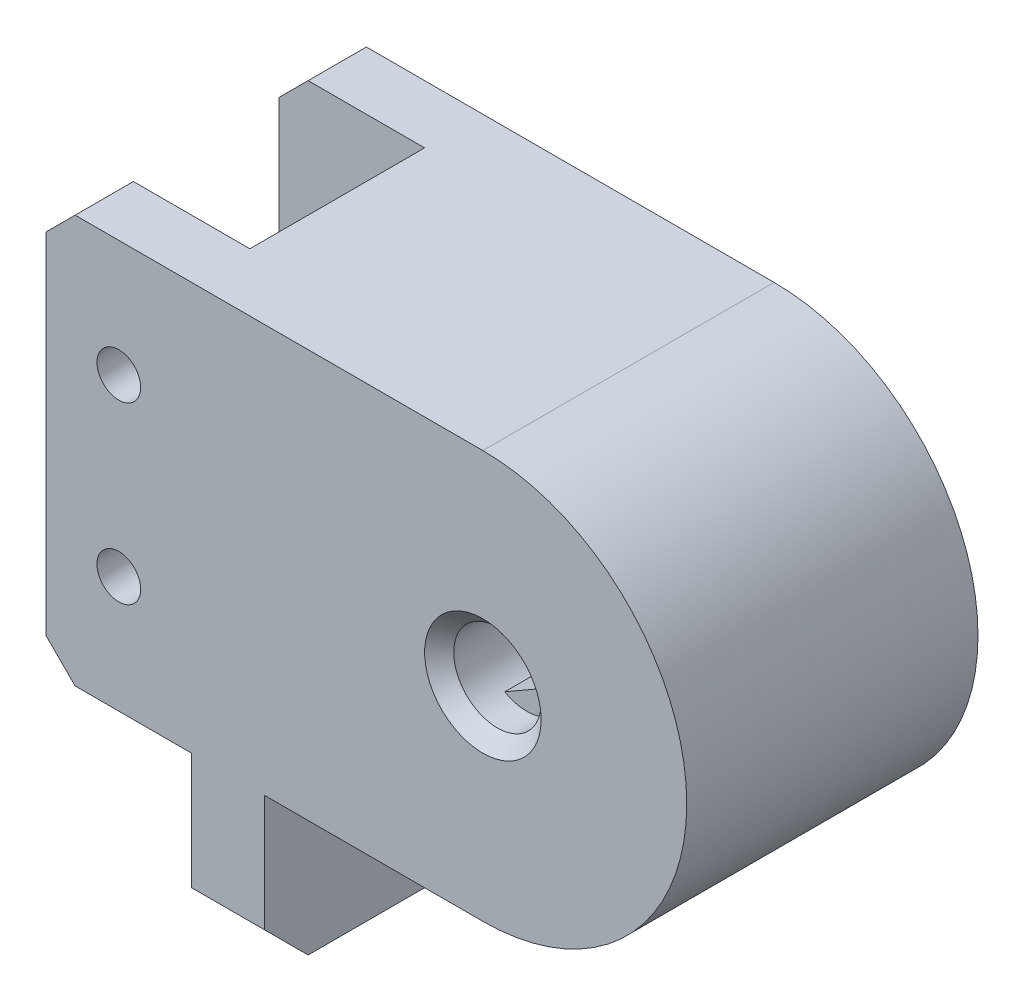
ISO-10303-21;
HEADER;
FILE_DESCRIPTION(('STEP AP214'),'2;1');
FILE_NAME('part.step','',(''),(''),'','','');
FILE_SCHEMA(('AUTOMOTIVE_DESIGN { 1 0 10303 214 1 1 1 1 }'));
ENDSEC;
DATA;
#1=APPLICATION_CONTEXT('core data for automotive mechanical design processes');
#2=APPLICATION_PROTOCOL_DEFINITION('international standard','automotive_design',2000,#1);
#3=PRODUCT_CONTEXT('',#1,'mechanical');
#4=PRODUCT('Part','Part','',(#3));
#5=PRODUCT_RELATED_PRODUCT_CATEGORY('part','',(#4));
#6=PRODUCT_DEFINITION_FORMATION('','',#4);
#7=PRODUCT_DEFINITION_CONTEXT('part definition',#1,'design');
#8=PRODUCT_DEFINITION('design','',#6,#7);
#9=PRODUCT_DEFINITION_SHAPE('','',#8);
#10=(LENGTH_UNIT() NAMED_UNIT(*) SI_UNIT(.MILLI.,.METRE.));
#11=(NAMED_UNIT(*) PLANE_ANGLE_UNIT() SI_UNIT($,.RADIAN.));
#12=(NAMED_UNIT(*) SI_UNIT($,.STERADIAN.) SOLID_ANGLE_UNIT());
#13=UNCERTAINTY_MEASURE_WITH_UNIT(LENGTH_MEASURE(1.E-05),#10,'distance_accuracy_value','');
#14=(GEOMETRIC_REPRESENTATION_CONTEXT(3) GLOBAL_UNCERTAINTY_ASSIGNED_CONTEXT((#13)) GLOBAL_UNIT_ASSIGNED_CONTEXT((#10,
#11,#12)) REPRESENTATION_CONTEXT('',''));
#15=CARTESIAN_POINT('',(0.,0.,0.));
#16=DIRECTION('',(0.,0.,1.));
#17=DIRECTION('',(1.,0.,0.));
#18=AXIS2_PLACEMENT_3D('',#15,#16,#17);
#19=CARTESIAN_POINT('',(0.,-14.,20.));
#20=DIRECTION('',(0.,1.,0.));
#21=DIRECTION('',(-1.,0.,0.));
#22=AXIS2_PLACEMENT_3D('',#19,#20,#21);
#23=PLANE('',#22);
#24=DIRECTION('',(0.,0.,-1.));
#25=VECTOR('',#24,1.);
#26=CARTESIAN_POINT('',(-20.,-14.,20.));
#27=LINE('',#26,#25);
#28=CARTESIAN_POINT('',(-20.,-14.,20.));
#29=VERTEX_POINT('',#28);
#30=CARTESIAN_POINT('',(-20.,-14.,16.));
#31=VERTEX_POINT('',#30);
#32=EDGE_CURVE('E198',#29,#31,#27,.T.);
#33=ORIENTED_EDGE('',*,*,#32,.F.);
#34=DIRECTION('',(1.,0.,0.));
#35=VECTOR('',#34,1.);
#36=CARTESIAN_POINT('',(0.,-14.,20.));
#37=LINE('',#36,#35);
#38=CARTESIAN_POINT('',(-28.,-14.,20.));
#39=VERTEX_POINT('',#38);
#40=EDGE_CURVE('E218',#39,#29,#37,.T.);
#41=ORIENTED_EDGE('',*,*,#40,.F.);
#42=DIRECTION('',(0.,0.,-1.));
#43=VECTOR('',#42,1.);
#44=CARTESIAN_POINT('',(-28.,-14.,20.));
#45=LINE('',#44,#43);
#46=CARTESIAN_POINT('',(-28.,-14.,16.));
#47=VERTEX_POINT('',#46);
#48=EDGE_CURVE('E264',#39,#47,#45,.T.);
#49=ORIENTED_EDGE('',*,*,#48,.T.);
#50=DIRECTION('',(-1.,0.,0.));
#51=VECTOR('',#50,1.);
#52=CARTESIAN_POINT('',(-30.,-14.,16.));
#53=LINE('',#52,#51);
#54=EDGE_CURVE('E352',#31,#47,#53,.T.);
#55=ORIENTED_EDGE('',*,*,#54,.F.);
#56=EDGE_LOOP('',(#33,#41,#49,#55));
#57=FACE_BOUND('',#56,.T.);
#58=ADVANCED_FACE('F37',(#57),#23,.F.);
#59=CARTESIAN_POINT('',(-20.,-14.,4.));
#60=VERTEX_POINT('',#59);
#61=CARTESIAN_POINT('',(-20.,-14.,0.));
#62=VERTEX_POINT('',#61);
#63=EDGE_CURVE('E189',#60,#62,#27,.T.);
#64=ORIENTED_EDGE('',*,*,#63,.F.);
#65=DIRECTION('',(1.,0.,0.));
#66=VECTOR('',#65,1.);
#67=CARTESIAN_POINT('',(-30.,-14.,4.));
#68=LINE('',#67,#66);
#69=CARTESIAN_POINT('',(-28.,-14.,4.));
#70=VERTEX_POINT('',#69);
#71=EDGE_CURVE('E350',#70,#60,#68,.T.);
#72=ORIENTED_EDGE('',*,*,#71,.F.);
#73=DIRECTION('',(0.,0.,-1.));
#74=VECTOR('',#73,1.);
#75=CARTESIAN_POINT('',(-28.,-14.,20.));
#76=LINE('',#75,#74);
#77=CARTESIAN_POINT('',(-28.,-14.,0.));
#78=VERTEX_POINT('',#77);
#79=EDGE_CURVE('E203',#70,#78,#76,.T.);
#80=ORIENTED_EDGE('',*,*,#79,.T.);
#81=DIRECTION('',(1.,0.,0.));
#82=VECTOR('',#81,1.);
#83=CARTESIAN_POINT('',(0.,-14.,0.));
#84=LINE('',#83,#82);
#85=EDGE_CURVE('E180',#78,#62,#84,.T.);
#86=ORIENTED_EDGE('',*,*,#85,.T.);
#87=EDGE_LOOP('',(#64,#72,#80,#86));
#88=FACE_BOUND('',#87,.T.);
#89=ADVANCED_FACE('F201',(#88),#23,.F.);
#90=DIRECTION('',(0.,0.,1.));
#91=VECTOR('',#90,1.);
#92=CARTESIAN_POINT('',(-15.,-14.,20.));
#93=LINE('',#92,#91);
#94=CARTESIAN_POINT('',(-15.,-14.,0.));
#95=VERTEX_POINT('',#94);
#96=CARTESIAN_POINT('',(-15.,-14.,20.));
#97=VERTEX_POINT('',#96);
#98=EDGE_CURVE('E403',#95,#97,#93,.T.);
#99=ORIENTED_EDGE('',*,*,#98,.F.);
#100=CARTESIAN_POINT('',(0.,-14.,0.));
#101=VERTEX_POINT('',#100);
#102=EDGE_CURVE('E205',#95,#101,#84,.T.);
#103=ORIENTED_EDGE('',*,*,#102,.T.);
#104=DIRECTION('',(0.,0.,-1.));
#105=VECTOR('',#104,1.);
#106=CARTESIAN_POINT('',(0.,-14.,20.));
#107=LINE('',#106,#105);
#108=CARTESIAN_POINT('',(0.,-14.,20.));
#109=VERTEX_POINT('',#108);
#110=EDGE_CURVE('E214',#109,#101,#107,.T.);
#111=ORIENTED_EDGE('',*,*,#110,.F.);
#112=EDGE_CURVE('E328',#97,#109,#37,.T.);
#113=ORIENTED_EDGE('',*,*,#112,.F.);
#114=EDGE_LOOP('',(#99,#103,#111,#113));
#115=FACE_BOUND('',#114,.T.);
#116=ADVANCED_FACE('F427',(#115),#23,.F.);
#117=CARTESIAN_POINT('',(3.,0.,20.));
#118=DIRECTION('',(0.499999999999998,-0.86602540378444,0.));
#119=DIRECTION('',(0.86602540378444,0.499999999999998,0.));
#120=AXIS2_PLACEMENT_3D('',#117,#118,#119);
#121=PLANE('',#120);
#122=DIRECTION('',(-0.86602540378444,-0.499999999999998,0.));
#123=VECTOR('',#122,1.);
#124=CARTESIAN_POINT('',(3.,0.,17.));
#125=LINE('',#124,#123);
#126=CARTESIAN_POINT('',(3.,0.,17.));
#127=VERTEX_POINT('',#126);
#128=CARTESIAN_POINT('',(-1.50000000000001,-2.59807621135331,17.));
#129=VERTEX_POINT('',#128);
#130=EDGE_CURVE('E394',#127,#129,#125,.T.);
#131=ORIENTED_EDGE('',*,*,#130,.F.);
#132=DIRECTION('',(0.,0.,-1.));
#133=VECTOR('',#132,1.);
#134=CARTESIAN_POINT('',(3.,0.,20.));
#135=LINE('',#134,#133);
#136=CARTESIAN_POINT('',(3.,0.,3.));
#137=VERTEX_POINT('',#136);
#138=EDGE_CURVE('E309',#127,#137,#135,.T.);
#139=ORIENTED_EDGE('',*,*,#138,.T.);
#140=DIRECTION('',(0.86602540378444,0.499999999999998,0.));
#141=VECTOR('',#140,1.);
#142=CARTESIAN_POINT('',(3.,0.,3.));
#143=LINE('',#142,#141);
#144=CARTESIAN_POINT('',(-1.50000000000002,-2.59807621135331,3.));
#145=VERTEX_POINT('',#144);
#146=EDGE_CURVE('E221',#145,#137,#143,.T.);
#147=ORIENTED_EDGE('',*,*,#146,.F.);
#148=DIRECTION('',(0.,0.,-1.));
#149=VECTOR('',#148,1.);
#150=CARTESIAN_POINT('',(-1.50000000000002,-2.59807621135331,20.));
#151=LINE('',#150,#149);
#152=EDGE_CURVE('E316',#129,#145,#151,.T.);
#153=ORIENTED_EDGE('',*,*,#152,.F.);
#154=EDGE_LOOP('',(#131,#139,#147,#153));
#155=FACE_BOUND('',#154,.T.);
#156=ADVANCED_FACE('F435',(#155),#121,.F.);
#157=CARTESIAN_POINT('',(-30.,14.,20.));
#158=DIRECTION('',(1.,0.,0.));
#159=DIRECTION('',(0.,1.,0.));
#160=AXIS2_PLACEMENT_3D('',#157,#158,#159);
#161=PLANE('',#160);
#162=DIRECTION('',(0.,-1.,0.));
#163=VECTOR('',#162,1.);
#164=CARTESIAN_POINT('',(-30.,14.,20.));
#165=LINE('',#164,#163);
#166=CARTESIAN_POINT('',(-30.,12.,20.));
#167=VERTEX_POINT('',#166);
#168=CARTESIAN_POINT('',(-30.,-12.,20.));
#169=VERTEX_POINT('',#168);
#170=EDGE_CURVE('E325',#167,#169,#165,.T.);
#171=ORIENTED_EDGE('',*,*,#170,.F.);
#172=DIRECTION('',(0.,0.,-1.));
#173=VECTOR('',#172,1.);
#174=CARTESIAN_POINT('',(-30.,12.,20.));
#175=LINE('',#174,#173);
#176=CARTESIAN_POINT('',(-30.,12.,16.));
#177=VERTEX_POINT('',#176);
#178=EDGE_CURVE('E253',#167,#177,#175,.T.);
#179=ORIENTED_EDGE('',*,*,#178,.T.);
#180=DIRECTION('',(0.,-1.,0.));
#181=VECTOR('',#180,1.);
#182=CARTESIAN_POINT('',(-30.,14.,16.));
#183=LINE('',#182,#181);
#184=CARTESIAN_POINT('',(-30.,-12.,16.));
#185=VERTEX_POINT('',#184);
#186=EDGE_CURVE('E320',#177,#185,#183,.T.);
#187=ORIENTED_EDGE('',*,*,#186,.T.);
#188=DIRECTION('',(0.,0.,1.));
#189=VECTOR('',#188,1.);
#190=CARTESIAN_POINT('',(-30.,-12.,20.));
#191=LINE('',#190,#189);
#192=EDGE_CURVE('E251',#185,#169,#191,.T.);
#193=ORIENTED_EDGE('',*,*,#192,.T.);
#194=EDGE_LOOP('',(#171,#179,#187,#193));
#195=FACE_BOUND('',#194,.T.);
#196=ADVANCED_FACE('F440',(#195),#161,.F.);
#197=CARTESIAN_POINT('',(0.,0.,20.));
#198=DIRECTION('',(0.,0.,-1.));
#199=DIRECTION('',(-1.,0.,0.));
#200=AXIS2_PLACEMENT_3D('',#197,#198,#199);
#201=CYLINDRICAL_SURFACE('',#200,14.);
#202=CARTESIAN_POINT('',(0.,0.,0.));
#203=DIRECTION('',(0.,0.,1.));
#204=DIRECTION('',(1.,0.,0.));
#205=AXIS2_PLACEMENT_3D('',#202,#203,#204);
#206=CIRCLE('',#205,14.);
#207=CARTESIAN_POINT('',(0.,14.,0.));
#208=VERTEX_POINT('',#207);
#209=EDGE_CURVE('E318',#101,#208,#206,.T.);
#210=ORIENTED_EDGE('',*,*,#209,.T.);
#211=DIRECTION('',(0.,0.,-1.));
#212=VECTOR('',#211,1.);
#213=CARTESIAN_POINT('',(0.,14.,20.));
#214=LINE('',#213,#212);
#215=CARTESIAN_POINT('',(0.,14.,20.));
#216=VERTEX_POINT('',#215);
#217=EDGE_CURVE('E217',#216,#208,#214,.T.);
#218=ORIENTED_EDGE('',*,*,#217,.F.);
#219=CARTESIAN_POINT('',(0.,0.,20.));
#220=DIRECTION('',(0.,0.,1.));
#221=DIRECTION('',(1.,0.,0.));
#222=AXIS2_PLACEMENT_3D('',#219,#220,#221);
#223=CIRCLE('',#222,14.);
#224=EDGE_CURVE('E204',#109,#216,#223,.T.);
#225=ORIENTED_EDGE('',*,*,#224,.F.);
#226=ORIENTED_EDGE('',*,*,#110,.T.);
#227=EDGE_LOOP('',(#210,#218,#225,#226));
#228=FACE_BOUND('',#227,.T.);
#229=ADVANCED_FACE('F449',(#228),#201,.T.);
#230=CARTESIAN_POINT('',(0.,14.,20.));
#231=DIRECTION('',(0.,-1.,0.));
#232=DIRECTION('',(1.,0.,0.));
#233=AXIS2_PLACEMENT_3D('',#230,#231,#232);
#234=PLANE('',#233);
#235=DIRECTION('',(-1.,0.,0.));
#236=VECTOR('',#235,1.);
#237=CARTESIAN_POINT('',(0.,14.,0.));
#238=LINE('',#237,#236);
#239=CARTESIAN_POINT('',(-28.,14.,0.));
#240=VERTEX_POINT('',#239);
#241=EDGE_CURVE('E332',#208,#240,#238,.T.);
#242=ORIENTED_EDGE('',*,*,#241,.T.);
#243=DIRECTION('',(0.,0.,1.));
#244=VECTOR('',#243,1.);
#245=CARTESIAN_POINT('',(-28.,14.,20.));
#246=LINE('',#245,#244);
#247=CARTESIAN_POINT('',(-28.,14.,4.));
#248=VERTEX_POINT('',#247);
#249=EDGE_CURVE('E245',#240,#248,#246,.T.);
#250=ORIENTED_EDGE('',*,*,#249,.T.);
#251=DIRECTION('',(1.,0.,0.));
#252=VECTOR('',#251,1.);
#253=CARTESIAN_POINT('',(-30.,14.,4.));
#254=LINE('',#253,#252);
#255=CARTESIAN_POINT('',(-20.,14.,4.));
#256=VERTEX_POINT('',#255);
#257=EDGE_CURVE('E355',#248,#256,#254,.T.);
#258=ORIENTED_EDGE('',*,*,#257,.T.);
#259=DIRECTION('',(0.,0.,1.));
#260=VECTOR('',#259,1.);
#261=CARTESIAN_POINT('',(-20.,14.,4.));
#262=LINE('',#261,#260);
#263=CARTESIAN_POINT('',(-20.,14.,16.));
#264=VERTEX_POINT('',#263);
#265=EDGE_CURVE('E370',#256,#264,#262,.T.);
#266=ORIENTED_EDGE('',*,*,#265,.T.);
#267=DIRECTION('',(-1.,0.,0.));
#268=VECTOR('',#267,1.);
#269=CARTESIAN_POINT('',(-30.,14.,16.));
#270=LINE('',#269,#268);
#271=CARTESIAN_POINT('',(-28.,14.,16.));
#272=VERTEX_POINT('',#271);
#273=EDGE_CURVE('E360',#264,#272,#270,.T.);
#274=ORIENTED_EDGE('',*,*,#273,.T.);
#275=DIRECTION('',(0.,0.,1.));
#276=VECTOR('',#275,1.);
#277=CARTESIAN_POINT('',(-28.,14.,20.));
#278=LINE('',#277,#276);
#279=CARTESIAN_POINT('',(-28.,14.,20.));
#280=VERTEX_POINT('',#279);
#281=EDGE_CURVE('E243',#272,#280,#278,.T.);
#282=ORIENTED_EDGE('',*,*,#281,.T.);
#283=DIRECTION('',(-1.,0.,0.));
#284=VECTOR('',#283,1.);
#285=CARTESIAN_POINT('',(0.,14.,20.));
#286=LINE('',#285,#284);
#287=EDGE_CURVE('E208',#216,#280,#286,.T.);
#288=ORIENTED_EDGE('',*,*,#287,.F.);
#289=ORIENTED_EDGE('',*,*,#217,.T.);
#290=EDGE_LOOP('',(#242,#250,#258,#266,#274,#282,#288,#289));
#291=FACE_BOUND('',#290,.T.);
#292=ADVANCED_FACE('F470',(#291),#234,.F.);
#293=DIRECTION('',(0.,-1.,0.));
#294=VECTOR('',#293,1.);
#295=CARTESIAN_POINT('',(-30.,14.,4.));
#296=LINE('',#295,#294);
#297=CARTESIAN_POINT('',(-30.,12.,4.));
#298=VERTEX_POINT('',#297);
#299=CARTESIAN_POINT('',(-30.,-12.,4.));
#300=VERTEX_POINT('',#299);
#301=EDGE_CURVE('E351',#298,#300,#296,.T.);
#302=ORIENTED_EDGE('',*,*,#301,.F.);
#303=DIRECTION('',(0.,0.,-1.));
#304=VECTOR('',#303,1.);
#305=CARTESIAN_POINT('',(-30.,12.,20.));
#306=LINE('',#305,#304);
#307=CARTESIAN_POINT('',(-30.,12.,0.));
#308=VERTEX_POINT('',#307);
#309=EDGE_CURVE('E236',#298,#308,#306,.T.);
#310=ORIENTED_EDGE('',*,*,#309,.T.);
#311=DIRECTION('',(0.,-1.,0.));
#312=VECTOR('',#311,1.);
#313=CARTESIAN_POINT('',(-30.,14.,0.));
#314=LINE('',#313,#312);
#315=CARTESIAN_POINT('',(-30.,-12.,0.));
#316=VERTEX_POINT('',#315);
#317=EDGE_CURVE('E210',#308,#316,#314,.T.);
#318=ORIENTED_EDGE('',*,*,#317,.T.);
#319=DIRECTION('',(0.,0.,1.));
#320=VECTOR('',#319,1.);
#321=CARTESIAN_POINT('',(-30.,-12.,20.));
#322=LINE('',#321,#320);
#323=EDGE_CURVE('E224',#316,#300,#322,.T.);
#324=ORIENTED_EDGE('',*,*,#323,.T.);
#325=EDGE_LOOP('',(#302,#310,#318,#324));
#326=FACE_BOUND('',#325,.T.);
#327=ADVANCED_FACE('F341',(#326),#161,.F.);
#328=CARTESIAN_POINT('',(0.,0.,20.));
#329=DIRECTION('',(0.,0.,1.));
#330=DIRECTION('',(1.,0.,0.));
#331=AXIS2_PLACEMENT_3D('',#328,#329,#330);
#332=PLANE('',#331);
#333=CARTESIAN_POINT('',(0.,0.,20.));
#334=DIRECTION('',(0.,0.,1.));
#335=DIRECTION('',(1.,0.,0.));
#336=AXIS2_PLACEMENT_3D('',#333,#334,#335);
#337=CIRCLE('',#336,3.99999999999999);
#338=CARTESIAN_POINT('',(3.99999999999999,0.,20.));
#339=VERTEX_POINT('',#338);
#340=EDGE_CURVE('E11',#339,#339,#337,.F.);
#341=ORIENTED_EDGE('',*,*,#340,.T.);
#342=EDGE_LOOP('',(#341));
#343=FACE_BOUND('',#342,.T.);
#344=CARTESIAN_POINT('',(-25.,6.,20.));
#345=DIRECTION('',(0.,0.,-1.));
#346=DIRECTION('',(-1.,0.,0.));
#347=AXIS2_PLACEMENT_3D('',#344,#345,#346);
#348=CIRCLE('',#347,1.5);
#349=CARTESIAN_POINT('',(-26.5,6.,20.));
#350=VERTEX_POINT('',#349);
#351=EDGE_CURVE('E234',#350,#350,#348,.T.);
#352=ORIENTED_EDGE('',*,*,#351,.T.);
#353=EDGE_LOOP('',(#352));
#354=FACE_BOUND('',#353,.T.);
#355=CARTESIAN_POINT('',(-25.,-6.,20.));
#356=DIRECTION('',(0.,0.,-1.));
#357=DIRECTION('',(-1.,0.,0.));
#358=AXIS2_PLACEMENT_3D('',#355,#356,#357);
#359=CIRCLE('',#358,1.5);
#360=CARTESIAN_POINT('',(-26.5,-6.,20.));
#361=VERTEX_POINT('',#360);
#362=EDGE_CURVE('E229',#361,#361,#359,.T.);
#363=ORIENTED_EDGE('',*,*,#362,.T.);
#364=EDGE_LOOP('',(#363));
#365=FACE_BOUND('',#364,.T.);
#366=DIRECTION('',(0.,1.,0.));
#367=VECTOR('',#366,1.);
#368=CARTESIAN_POINT('',(-20.,-25.,20.));
#369=LINE('',#368,#367);
#370=CARTESIAN_POINT('',(-20.,-22.,20.));
#371=VERTEX_POINT('',#370);
#372=EDGE_CURVE('E400',#371,#29,#369,.T.);
#373=ORIENTED_EDGE('',*,*,#372,.F.);
#374=DIRECTION('',(1.,0.,0.));
#375=VECTOR('',#374,1.);
#376=CARTESIAN_POINT('',(0.,-22.,20.));
#377=LINE('',#376,#375);
#378=CARTESIAN_POINT('',(-15.,-22.,20.));
#379=VERTEX_POINT('',#378);
#380=EDGE_CURVE('E61',#371,#379,#377,.T.);
#381=ORIENTED_EDGE('',*,*,#380,.T.);
#382=DIRECTION('',(0.,1.,0.));
#383=VECTOR('',#382,1.);
#384=CARTESIAN_POINT('',(-15.,-25.,20.));
#385=LINE('',#384,#383);
#386=EDGE_CURVE('E398',#379,#97,#385,.T.);
#387=ORIENTED_EDGE('',*,*,#386,.T.);
#388=ORIENTED_EDGE('',*,*,#112,.T.);
#389=ORIENTED_EDGE('',*,*,#224,.T.);
#390=ORIENTED_EDGE('',*,*,#287,.T.);
#391=DIRECTION('',(0.70710678118655,0.707106781186545,0.));
#392=VECTOR('',#391,1.);
#393=CARTESIAN_POINT('',(-20.9999999999999,21.,20.));
#394=LINE('',#393,#392);
#395=EDGE_CURVE('E262',#280,#167,#394,.F.);
#396=ORIENTED_EDGE('',*,*,#395,.T.);
#397=ORIENTED_EDGE('',*,*,#170,.T.);
#398=DIRECTION('',(-0.707106781186546,0.707106781186549,0.));
#399=VECTOR('',#398,1.);
#400=CARTESIAN_POINT('',(-21.0000000000001,-21.,20.));
#401=LINE('',#400,#399);
#402=EDGE_CURVE('E260',#169,#39,#401,.F.);
#403=ORIENTED_EDGE('',*,*,#402,.T.);
#404=ORIENTED_EDGE('',*,*,#40,.T.);
#405=EDGE_LOOP('',(#373,#381,#387,#388,#389,#390,#396,#397,#403,#404));
#406=FACE_BOUND('',#405,.T.);
#407=ADVANCED_FACE('F451',(#343,#354,#365,#406),#332,.T.);
#408=CARTESIAN_POINT('',(0.,0.,0.));
#409=DIRECTION('',(0.,0.,1.));
#410=DIRECTION('',(1.,0.,0.));
#411=AXIS2_PLACEMENT_3D('',#408,#409,#410);
#412=PLANE('',#411);
#413=CARTESIAN_POINT('',(0.,0.,0.));
#414=DIRECTION('',(0.,0.,1.));
#415=DIRECTION('',(1.,0.,0.));
#416=AXIS2_PLACEMENT_3D('',#413,#414,#415);
#417=CIRCLE('',#416,4.00000000000002);
#418=CARTESIAN_POINT('',(4.00000000000002,0.,0.));
#419=VERTEX_POINT('',#418);
#420=EDGE_CURVE('E46',#419,#419,#417,.T.);
#421=ORIENTED_EDGE('',*,*,#420,.T.);
#422=EDGE_LOOP('',(#421));
#423=FACE_BOUND('',#422,.T.);
#424=CARTESIAN_POINT('',(-25.,6.,0.));
#425=DIRECTION('',(0.,0.,-1.));
#426=DIRECTION('',(-1.,0.,0.));
#427=AXIS2_PLACEMENT_3D('',#424,#425,#426);
#428=CIRCLE('',#427,1.525);
#429=CARTESIAN_POINT('',(-26.525,6.,0.));
#430=VERTEX_POINT('',#429);
#431=EDGE_CURVE('E391',#430,#430,#428,.T.);
#432=ORIENTED_EDGE('',*,*,#431,.F.);
#433=EDGE_LOOP('',(#432));
#434=FACE_BOUND('',#433,.T.);
#435=CARTESIAN_POINT('',(-25.,-6.,0.));
#436=DIRECTION('',(0.,0.,-1.));
#437=DIRECTION('',(-1.,0.,0.));
#438=AXIS2_PLACEMENT_3D('',#435,#436,#437);
#439=CIRCLE('',#438,1.525);
#440=CARTESIAN_POINT('',(-26.525,-6.,0.));
#441=VERTEX_POINT('',#440);
#442=EDGE_CURVE('E381',#441,#441,#439,.T.);
#443=ORIENTED_EDGE('',*,*,#442,.F.);
#444=EDGE_LOOP('',(#443));
#445=FACE_BOUND('',#444,.T.);
#446=DIRECTION('',(0.,1.,0.));
#447=VECTOR('',#446,1.);
#448=CARTESIAN_POINT('',(-15.,-25.,0.));
#449=LINE('',#448,#447);
#450=CARTESIAN_POINT('',(-15.,-22.,0.));
#451=VERTEX_POINT('',#450);
#452=EDGE_CURVE('E186',#451,#95,#449,.T.);
#453=ORIENTED_EDGE('',*,*,#452,.F.);
#454=DIRECTION('',(-1.,0.,0.));
#455=VECTOR('',#454,1.);
#456=CARTESIAN_POINT('',(-20.,-22.,0.));
#457=LINE('',#456,#455);
#458=CARTESIAN_POINT('',(-20.,-22.,0.));
#459=VERTEX_POINT('',#458);
#460=EDGE_CURVE('E182',#451,#459,#457,.T.);
#461=ORIENTED_EDGE('',*,*,#460,.T.);
#462=DIRECTION('',(0.,1.,0.));
#463=VECTOR('',#462,1.);
#464=CARTESIAN_POINT('',(-20.,-25.,0.));
#465=LINE('',#464,#463);
#466=EDGE_CURVE('E176',#459,#62,#465,.T.);
#467=ORIENTED_EDGE('',*,*,#466,.T.);
#468=ORIENTED_EDGE('',*,*,#85,.F.);
#469=DIRECTION('',(0.707106781186546,-0.707106781186549,0.));
#470=VECTOR('',#469,1.);
#471=CARTESIAN_POINT('',(-28.,-14.,0.));
#472=LINE('',#471,#470);
#473=EDGE_CURVE('E239',#78,#316,#472,.F.);
#474=ORIENTED_EDGE('',*,*,#473,.T.);
#475=ORIENTED_EDGE('',*,*,#317,.F.);
#476=DIRECTION('',(-0.70710678118655,-0.707106781186545,0.));
#477=VECTOR('',#476,1.);
#478=CARTESIAN_POINT('',(-30.,12.,0.));
#479=LINE('',#478,#477);
#480=EDGE_CURVE('E241',#308,#240,#479,.F.);
#481=ORIENTED_EDGE('',*,*,#480,.T.);
#482=ORIENTED_EDGE('',*,*,#241,.F.);
#483=ORIENTED_EDGE('',*,*,#209,.F.);
#484=ORIENTED_EDGE('',*,*,#102,.F.);
#485=EDGE_LOOP('',(#453,#461,#467,#468,#474,#475,#481,#482,#483,#484));
#486=FACE_BOUND('',#485,.T.);
#487=ADVANCED_FACE('F178',(#423,#434,#445,#486),#412,.F.);
#488=CARTESIAN_POINT('',(0.,0.,20.));
#489=DIRECTION('',(0.,0.,-1.));
#490=DIRECTION('',(-1.,0.,0.));
#491=AXIS2_PLACEMENT_3D('',#488,#489,#490);
#492=CYLINDRICAL_SURFACE('',#491,3.);
#493=CARTESIAN_POINT('',(0.,0.,1.00000000000001));
#494=DIRECTION('',(0.,0.,1.));
#495=DIRECTION('',(1.,0.,0.));
#496=AXIS2_PLACEMENT_3D('',#493,#494,#495);
#497=CIRCLE('',#496,3.);
#498=CARTESIAN_POINT('',(3.,0.,1.00000000000001));
#499=VERTEX_POINT('',#498);
#500=EDGE_CURVE('E286',#499,#499,#497,.F.);
#501=ORIENTED_EDGE('',*,*,#500,.T.);
#502=EDGE_LOOP('',(#501));
#503=FACE_BOUND('',#502,.T.);
#504=CARTESIAN_POINT('',(0.,0.,19.));
#505=DIRECTION('',(0.,0.,1.));
#506=DIRECTION('',(1.,0.,0.));
#507=AXIS2_PLACEMENT_3D('',#504,#505,#506);
#508=CIRCLE('',#507,3.);
#509=CARTESIAN_POINT('',(3.,0.,19.));
#510=VERTEX_POINT('',#509);
#511=EDGE_CURVE('E283',#510,#510,#508,.T.);
#512=ORIENTED_EDGE('',*,*,#511,.T.);
#513=EDGE_LOOP('',(#512));
#514=FACE_BOUND('',#513,.T.);
#515=ORIENTED_EDGE('',*,*,#138,.F.);
#516=CARTESIAN_POINT('',(0.,0.,17.));
#517=DIRECTION('',(0.,0.,1.));
#518=DIRECTION('',(1.,0.,0.));
#519=AXIS2_PLACEMENT_3D('',#516,#517,#518);
#520=CIRCLE('',#519,3.);
#521=EDGE_CURVE('E185',#129,#127,#520,.T.);
#522=ORIENTED_EDGE('',*,*,#521,.F.);
#523=ORIENTED_EDGE('',*,*,#152,.T.);
#524=CARTESIAN_POINT('',(0.,0.,3.));
#525=DIRECTION('',(0.,0.,-1.));
#526=DIRECTION('',(-1.,0.,0.));
#527=AXIS2_PLACEMENT_3D('',#524,#525,#526);
#528=CIRCLE('',#527,3.);
#529=EDGE_CURVE('E312',#137,#145,#528,.T.);
#530=ORIENTED_EDGE('',*,*,#529,.F.);
#531=EDGE_LOOP('',(#515,#522,#523,#530));
#532=FACE_BOUND('',#531,.T.);
#533=ADVANCED_FACE('F299',(#503,#514,#532),#492,.F.);
#534=CARTESIAN_POINT('',(0.,0.,3.));
#535=DIRECTION('',(0.,0.,-1.));
#536=DIRECTION('',(-1.,0.,0.));
#537=AXIS2_PLACEMENT_3D('',#534,#535,#536);
#538=PLANE('',#537);
#539=ORIENTED_EDGE('',*,*,#146,.T.);
#540=ORIENTED_EDGE('',*,*,#529,.T.);
#541=EDGE_LOOP('',(#539,#540));
#542=FACE_BOUND('',#541,.T.);
#543=ADVANCED_FACE('F302',(#542),#538,.T.);
#544=CARTESIAN_POINT('',(-30.,14.,16.));
#545=DIRECTION('',(0.,0.,1.));
#546=DIRECTION('',(1.,0.,0.));
#547=AXIS2_PLACEMENT_3D('',#544,#545,#546);
#548=PLANE('',#547);
#549=CARTESIAN_POINT('',(-25.,6.,16.));
#550=DIRECTION('',(0.,0.,1.));
#551=DIRECTION('',(1.,0.,0.));
#552=AXIS2_PLACEMENT_3D('',#549,#550,#551);
#553=CIRCLE('',#552,1.5);
#554=CARTESIAN_POINT('',(-23.5,6.,16.));
#555=VERTEX_POINT('',#554);
#556=EDGE_CURVE('E230',#555,#555,#553,.T.);
#557=ORIENTED_EDGE('',*,*,#556,.T.);
#558=EDGE_LOOP('',(#557));
#559=FACE_BOUND('',#558,.T.);
#560=CARTESIAN_POINT('',(-25.,-6.,16.));
#561=DIRECTION('',(0.,0.,1.));
#562=DIRECTION('',(1.,0.,0.));
#563=AXIS2_PLACEMENT_3D('',#560,#561,#562);
#564=CIRCLE('',#563,1.5);
#565=CARTESIAN_POINT('',(-23.5,-6.,16.));
#566=VERTEX_POINT('',#565);
#567=EDGE_CURVE('E228',#566,#566,#564,.T.);
#568=ORIENTED_EDGE('',*,*,#567,.T.);
#569=EDGE_LOOP('',(#568));
#570=FACE_BOUND('',#569,.T.);
#571=ORIENTED_EDGE('',*,*,#186,.F.);
#572=DIRECTION('',(-0.70710678118655,-0.707106781186545,0.));
#573=VECTOR('',#572,1.);
#574=CARTESIAN_POINT('',(-30.,12.,16.));
#575=LINE('',#574,#573);
#576=EDGE_CURVE('E258',#177,#272,#575,.F.);
#577=ORIENTED_EDGE('',*,*,#576,.T.);
#578=ORIENTED_EDGE('',*,*,#273,.F.);
#579=DIRECTION('',(0.,-1.,0.));
#580=VECTOR('',#579,1.);
#581=CARTESIAN_POINT('',(-20.,14.,16.));
#582=LINE('',#581,#580);
#583=EDGE_CURVE('E365',#264,#31,#582,.T.);
#584=ORIENTED_EDGE('',*,*,#583,.T.);
#585=ORIENTED_EDGE('',*,*,#54,.T.);
#586=DIRECTION('',(0.707106781186546,-0.707106781186549,0.));
#587=VECTOR('',#586,1.);
#588=CARTESIAN_POINT('',(-28.,-14.,16.));
#589=LINE('',#588,#587);
#590=EDGE_CURVE('E256',#47,#185,#589,.F.);
#591=ORIENTED_EDGE('',*,*,#590,.T.);
#592=EDGE_LOOP('',(#571,#577,#578,#584,#585,#591));
#593=FACE_BOUND('',#592,.T.);
#594=ADVANCED_FACE('F464',(#559,#570,#593),#548,.F.);
#595=CARTESIAN_POINT('',(-20.,14.,4.));
#596=DIRECTION('',(1.,0.,0.));
#597=DIRECTION('',(0.,1.,0.));
#598=AXIS2_PLACEMENT_3D('',#595,#596,#597);
#599=PLANE('',#598);
#600=DIRECTION('',(0.,0.,-1.));
#601=VECTOR('',#600,1.);
#602=CARTESIAN_POINT('',(-20.,-25.,20.));
#603=LINE('',#602,#601);
#604=CARTESIAN_POINT('',(-20.,-25.,17.));
#605=VERTEX_POINT('',#604);
#606=CARTESIAN_POINT('',(-20.,-25.,3.));
#607=VERTEX_POINT('',#606);
#608=EDGE_CURVE('E405',#605,#607,#603,.T.);
#609=ORIENTED_EDGE('',*,*,#608,.F.);
#610=DIRECTION('',(0.,-0.707106781186549,-0.707106781186546));
#611=VECTOR('',#610,1.);
#612=CARTESIAN_POINT('',(-20.,-25.,17.));
#613=LINE('',#612,#611);
#614=EDGE_CURVE('E276',#605,#371,#613,.F.);
#615=ORIENTED_EDGE('',*,*,#614,.T.);
#616=ORIENTED_EDGE('',*,*,#372,.T.);
#617=ORIENTED_EDGE('',*,*,#32,.T.);
#618=ORIENTED_EDGE('',*,*,#583,.F.);
#619=ORIENTED_EDGE('',*,*,#265,.F.);
#620=DIRECTION('',(0.,-1.,0.));
#621=VECTOR('',#620,1.);
#622=CARTESIAN_POINT('',(-20.,14.,4.));
#623=LINE('',#622,#621);
#624=EDGE_CURVE('E194',#256,#60,#623,.T.);
#625=ORIENTED_EDGE('',*,*,#624,.T.);
#626=ORIENTED_EDGE('',*,*,#63,.T.);
#627=ORIENTED_EDGE('',*,*,#466,.F.);
#628=DIRECTION('',(0.,-0.707106781186549,0.707106781186546));
#629=VECTOR('',#628,1.);
#630=CARTESIAN_POINT('',(-20.,-25.,3.));
#631=LINE('',#630,#629);
#632=EDGE_CURVE('E274',#459,#607,#631,.T.);
#633=ORIENTED_EDGE('',*,*,#632,.T.);
#634=EDGE_LOOP('',(#609,#615,#616,#617,#618,#619,#625,#626,#627,#633));
#635=FACE_BOUND('',#634,.T.);
#636=ADVANCED_FACE('F191',(#635),#599,.F.);
#637=CARTESIAN_POINT('',(-30.,14.,4.));
#638=DIRECTION('',(0.,0.,-1.));
#639=DIRECTION('',(-1.,0.,0.));
#640=AXIS2_PLACEMENT_3D('',#637,#638,#639);
#641=PLANE('',#640);
#642=CARTESIAN_POINT('',(-25.,6.,4.));
#643=DIRECTION('',(0.,0.,-1.));
#644=DIRECTION('',(-1.,0.,0.));
#645=AXIS2_PLACEMENT_3D('',#642,#643,#644);
#646=CIRCLE('',#645,1.5);
#647=CARTESIAN_POINT('',(-26.5,6.,4.));
#648=VERTEX_POINT('',#647);
#649=EDGE_CURVE('E233',#648,#648,#646,.T.);
#650=ORIENTED_EDGE('',*,*,#649,.T.);
#651=EDGE_LOOP('',(#650));
#652=FACE_BOUND('',#651,.T.);
#653=CARTESIAN_POINT('',(-25.,-6.,4.));
#654=DIRECTION('',(0.,0.,-1.));
#655=DIRECTION('',(-1.,0.,0.));
#656=AXIS2_PLACEMENT_3D('',#653,#654,#655);
#657=CIRCLE('',#656,1.5);
#658=CARTESIAN_POINT('',(-26.5,-6.,4.));
#659=VERTEX_POINT('',#658);
#660=EDGE_CURVE('E225',#659,#659,#657,.T.);
#661=ORIENTED_EDGE('',*,*,#660,.T.);
#662=EDGE_LOOP('',(#661));
#663=FACE_BOUND('',#662,.T.);
#664=ORIENTED_EDGE('',*,*,#257,.F.);
#665=DIRECTION('',(0.70710678118655,0.707106781186545,0.));
#666=VECTOR('',#665,1.);
#667=CARTESIAN_POINT('',(-30.,12.,4.));
#668=LINE('',#667,#666);
#669=EDGE_CURVE('E249',#248,#298,#668,.F.);
#670=ORIENTED_EDGE('',*,*,#669,.T.);
#671=ORIENTED_EDGE('',*,*,#301,.T.);
#672=DIRECTION('',(-0.707106781186546,0.707106781186549,0.));
#673=VECTOR('',#672,1.);
#674=CARTESIAN_POINT('',(-28.,-14.,4.));
#675=LINE('',#674,#673);
#676=EDGE_CURVE('E247',#300,#70,#675,.F.);
#677=ORIENTED_EDGE('',*,*,#676,.T.);
#678=ORIENTED_EDGE('',*,*,#71,.T.);
#679=ORIENTED_EDGE('',*,*,#624,.F.);
#680=EDGE_LOOP('',(#664,#670,#671,#677,#678,#679));
#681=FACE_BOUND('',#680,.T.);
#682=ADVANCED_FACE('F349',(#652,#663,#681),#641,.F.);
#683=CARTESIAN_POINT('',(-25.,-6.,0.));
#684=DIRECTION('',(0.,0.,-1.));
#685=DIRECTION('',(-1.,0.,0.));
#686=AXIS2_PLACEMENT_3D('',#683,#684,#685);
#687=CYLINDRICAL_SURFACE('',#686,1.5);
#688=CARTESIAN_POINT('',(-25.,-6.,0.025));
#689=DIRECTION('',(0.,0.,-1.));
#690=DIRECTION('',(-1.,0.,0.));
#691=AXIS2_PLACEMENT_3D('',#688,#689,#690);
#692=CIRCLE('',#691,1.5);
#693=CARTESIAN_POINT('',(-26.5,-6.,0.025));
#694=VERTEX_POINT('',#693);
#695=EDGE_CURVE('E378',#694,#694,#692,.T.);
#696=ORIENTED_EDGE('',*,*,#695,.T.);
#697=EDGE_LOOP('',(#696));
#698=FACE_BOUND('',#697,.T.);
#699=ORIENTED_EDGE('',*,*,#660,.F.);
#700=EDGE_LOOP('',(#699));
#701=FACE_BOUND('',#700,.T.);
#702=ADVANCED_FACE('F535',(#698,#701),#687,.F.);
#703=CARTESIAN_POINT('',(-25.,-6.,0.));
#704=DIRECTION('',(0.,0.,-1.));
#705=DIRECTION('',(-1.,0.,0.));
#706=AXIS2_PLACEMENT_3D('',#703,#704,#705);
#707=CONICAL_SURFACE('',#706,1.525,0.785398163397394);
#708=ORIENTED_EDGE('',*,*,#695,.F.);
#709=EDGE_LOOP('',(#708));
#710=FACE_BOUND('',#709,.T.);
#711=ORIENTED_EDGE('',*,*,#442,.T.);
#712=EDGE_LOOP('',(#711));
#713=FACE_BOUND('',#712,.T.);
#714=ADVANCED_FACE('F531',(#710,#713),#707,.F.);
#715=ORIENTED_EDGE('',*,*,#362,.F.);
#716=EDGE_LOOP('',(#715));
#717=FACE_BOUND('',#716,.T.);
#718=ORIENTED_EDGE('',*,*,#567,.F.);
#719=EDGE_LOOP('',(#718));
#720=FACE_BOUND('',#719,.T.);
#721=ADVANCED_FACE('F534',(#717,#720),#687,.F.);
#722=CARTESIAN_POINT('',(-25.,6.,0.));
#723=DIRECTION('',(0.,0.,-1.));
#724=DIRECTION('',(-1.,0.,0.));
#725=AXIS2_PLACEMENT_3D('',#722,#723,#724);
#726=CYLINDRICAL_SURFACE('',#725,1.5);
#727=ORIENTED_EDGE('',*,*,#351,.F.);
#728=EDGE_LOOP('',(#727));
#729=FACE_BOUND('',#728,.T.);
#730=ORIENTED_EDGE('',*,*,#556,.F.);
#731=EDGE_LOOP('',(#730));
#732=FACE_BOUND('',#731,.T.);
#733=ADVANCED_FACE('F529',(#729,#732),#726,.F.);
#734=CARTESIAN_POINT('',(-25.,6.,0.025));
#735=DIRECTION('',(0.,0.,-1.));
#736=DIRECTION('',(-1.,0.,0.));
#737=AXIS2_PLACEMENT_3D('',#734,#735,#736);
#738=CIRCLE('',#737,1.5);
#739=CARTESIAN_POINT('',(-26.5,6.,0.025));
#740=VERTEX_POINT('',#739);
#741=EDGE_CURVE('E388',#740,#740,#738,.T.);
#742=ORIENTED_EDGE('',*,*,#741,.T.);
#743=EDGE_LOOP('',(#742));
#744=FACE_BOUND('',#743,.T.);
#745=ORIENTED_EDGE('',*,*,#649,.F.);
#746=EDGE_LOOP('',(#745));
#747=FACE_BOUND('',#746,.T.);
#748=ADVANCED_FACE('F525',(#744,#747),#726,.F.);
#749=CARTESIAN_POINT('',(-25.,6.,0.));
#750=DIRECTION('',(0.,0.,-1.));
#751=DIRECTION('',(-1.,0.,0.));
#752=AXIS2_PLACEMENT_3D('',#749,#750,#751);
#753=CONICAL_SURFACE('',#752,1.525,0.785398163397394);
#754=ORIENTED_EDGE('',*,*,#741,.F.);
#755=EDGE_LOOP('',(#754));
#756=FACE_BOUND('',#755,.T.);
#757=ORIENTED_EDGE('',*,*,#431,.T.);
#758=EDGE_LOOP('',(#757));
#759=FACE_BOUND('',#758,.T.);
#760=ADVANCED_FACE('F486',(#756,#759),#753,.F.);
#761=CARTESIAN_POINT('',(-30.,12.,20.));
#762=DIRECTION('',(0.707106781186545,-0.70710678118655,0.));
#763=DIRECTION('',(0.,0.,-1.));
#764=AXIS2_PLACEMENT_3D('',#761,#762,#763);
#765=PLANE('',#764);
#766=ORIENTED_EDGE('',*,*,#669,.F.);
#767=ORIENTED_EDGE('',*,*,#249,.F.);
#768=ORIENTED_EDGE('',*,*,#480,.F.);
#769=ORIENTED_EDGE('',*,*,#309,.F.);
#770=EDGE_LOOP('',(#766,#767,#768,#769));
#771=FACE_BOUND('',#770,.T.);
#772=ADVANCED_FACE('F480',(#771),#765,.F.);
#773=CARTESIAN_POINT('',(-30.,12.,20.));
#774=DIRECTION('',(0.707106781186545,-0.70710678118655,0.));
#775=DIRECTION('',(0.,0.,-1.));
#776=AXIS2_PLACEMENT_3D('',#773,#774,#775);
#777=PLANE('',#776);
#778=ORIENTED_EDGE('',*,*,#395,.F.);
#779=ORIENTED_EDGE('',*,*,#281,.F.);
#780=ORIENTED_EDGE('',*,*,#576,.F.);
#781=ORIENTED_EDGE('',*,*,#178,.F.);
#782=EDGE_LOOP('',(#778,#779,#780,#781));
#783=FACE_BOUND('',#782,.T.);
#784=ADVANCED_FACE('F469',(#783),#777,.F.);
#785=CARTESIAN_POINT('',(-28.,-14.,20.));
#786=DIRECTION('',(0.707106781186549,0.707106781186546,0.));
#787=DIRECTION('',(0.,0.,-1.));
#788=AXIS2_PLACEMENT_3D('',#785,#786,#787);
#789=PLANE('',#788);
#790=ORIENTED_EDGE('',*,*,#676,.F.);
#791=ORIENTED_EDGE('',*,*,#323,.F.);
#792=ORIENTED_EDGE('',*,*,#473,.F.);
#793=ORIENTED_EDGE('',*,*,#79,.F.);
#794=EDGE_LOOP('',(#790,#791,#792,#793));
#795=FACE_BOUND('',#794,.T.);
#796=ADVANCED_FACE('F346',(#795),#789,.F.);
#797=CARTESIAN_POINT('',(-28.,-14.,20.));
#798=DIRECTION('',(0.707106781186549,0.707106781186546,0.));
#799=DIRECTION('',(0.,0.,-1.));
#800=AXIS2_PLACEMENT_3D('',#797,#798,#799);
#801=PLANE('',#800);
#802=ORIENTED_EDGE('',*,*,#402,.F.);
#803=ORIENTED_EDGE('',*,*,#192,.F.);
#804=ORIENTED_EDGE('',*,*,#590,.F.);
#805=ORIENTED_EDGE('',*,*,#48,.F.);
#806=EDGE_LOOP('',(#802,#803,#804,#805));
#807=FACE_BOUND('',#806,.T.);
#808=ADVANCED_FACE('F460',(#807),#801,.F.);
#809=CARTESIAN_POINT('',(0.,0.,17.));
#810=DIRECTION('',(0.,0.,1.));
#811=DIRECTION('',(1.,0.,0.));
#812=AXIS2_PLACEMENT_3D('',#809,#810,#811);
#813=PLANE('',#812);
#814=ORIENTED_EDGE('',*,*,#130,.T.);
#815=ORIENTED_EDGE('',*,*,#521,.T.);
#816=EDGE_LOOP('',(#814,#815));
#817=FACE_BOUND('',#816,.T.);
#818=ADVANCED_FACE('F502',(#817),#813,.T.);
#819=CARTESIAN_POINT('',(-15.,-25.,20.));
#820=DIRECTION('',(-1.,0.,0.));
#821=DIRECTION('',(0.,-1.,0.));
#822=AXIS2_PLACEMENT_3D('',#819,#820,#821);
#823=PLANE('',#822);
#824=ORIENTED_EDGE('',*,*,#386,.F.);
#825=DIRECTION('',(0.,0.707106781186549,0.707106781186546));
#826=VECTOR('',#825,1.);
#827=CARTESIAN_POINT('',(-15.,-25.,17.));
#828=LINE('',#827,#826);
#829=CARTESIAN_POINT('',(-15.,-25.,17.));
#830=VERTEX_POINT('',#829);
#831=EDGE_CURVE('E280',#379,#830,#828,.F.);
#832=ORIENTED_EDGE('',*,*,#831,.T.);
#833=DIRECTION('',(0.,0.,1.));
#834=VECTOR('',#833,1.);
#835=CARTESIAN_POINT('',(-15.,-25.,20.));
#836=LINE('',#835,#834);
#837=CARTESIAN_POINT('',(-15.,-25.,3.));
#838=VERTEX_POINT('',#837);
#839=EDGE_CURVE('E402',#838,#830,#836,.T.);
#840=ORIENTED_EDGE('',*,*,#839,.F.);
#841=DIRECTION('',(0.,0.707106781186549,-0.707106781186546));
#842=VECTOR('',#841,1.);
#843=CARTESIAN_POINT('',(-15.,-25.,3.));
#844=LINE('',#843,#842);
#845=EDGE_CURVE('E53',#838,#451,#844,.T.);
#846=ORIENTED_EDGE('',*,*,#845,.T.);
#847=ORIENTED_EDGE('',*,*,#452,.T.);
#848=ORIENTED_EDGE('',*,*,#98,.T.);
#849=EDGE_LOOP('',(#824,#832,#840,#846,#847,#848));
#850=FACE_BOUND('',#849,.T.);
#851=ADVANCED_FACE('F454',(#850),#823,.F.);
#852=CARTESIAN_POINT('',(0.,-25.,0.));
#853=DIRECTION('',(0.,-1.,0.));
#854=DIRECTION('',(0.,0.,-1.));
#855=AXIS2_PLACEMENT_3D('',#852,#853,#854);
#856=PLANE('',#855);
#857=ORIENTED_EDGE('',*,*,#839,.T.);
#858=DIRECTION('',(-1.,0.,0.));
#859=VECTOR('',#858,1.);
#860=CARTESIAN_POINT('',(0.,-25.,17.));
#861=LINE('',#860,#859);
#862=EDGE_CURVE('E271',#830,#605,#861,.T.);
#863=ORIENTED_EDGE('',*,*,#862,.T.);
#864=ORIENTED_EDGE('',*,*,#608,.T.);
#865=DIRECTION('',(1.,0.,0.));
#866=VECTOR('',#865,1.);
#867=CARTESIAN_POINT('',(-15.,-25.,3.));
#868=LINE('',#867,#866);
#869=EDGE_CURVE('E268',#607,#838,#868,.T.);
#870=ORIENTED_EDGE('',*,*,#869,.T.);
#871=EDGE_LOOP('',(#857,#863,#864,#870));
#872=FACE_BOUND('',#871,.T.);
#873=ADVANCED_FACE('F412',(#872),#856,.T.);
#874=CARTESIAN_POINT('',(0.,-25.,17.));
#875=DIRECTION('',(0.,0.707106781186546,-0.707106781186549));
#876=DIRECTION('',(-1.,0.,0.));
#877=AXIS2_PLACEMENT_3D('',#874,#875,#876);
#878=PLANE('',#877);
#879=ORIENTED_EDGE('',*,*,#831,.F.);
#880=ORIENTED_EDGE('',*,*,#380,.F.);
#881=ORIENTED_EDGE('',*,*,#614,.F.);
#882=ORIENTED_EDGE('',*,*,#862,.F.);
#883=EDGE_LOOP('',(#879,#880,#881,#882));
#884=FACE_BOUND('',#883,.T.);
#885=ADVANCED_FACE('F416',(#884),#878,.F.);
#886=CARTESIAN_POINT('',(0.,-25.,3.));
#887=DIRECTION('',(0.,-0.707106781186546,-0.707106781186549));
#888=DIRECTION('',(-1.,0.,0.));
#889=AXIS2_PLACEMENT_3D('',#886,#887,#888);
#890=PLANE('',#889);
#891=ORIENTED_EDGE('',*,*,#632,.F.);
#892=ORIENTED_EDGE('',*,*,#460,.F.);
#893=ORIENTED_EDGE('',*,*,#845,.F.);
#894=ORIENTED_EDGE('',*,*,#869,.F.);
#895=EDGE_LOOP('',(#891,#892,#893,#894));
#896=FACE_BOUND('',#895,.T.);
#897=ADVANCED_FACE('F296',(#896),#890,.T.);
#898=CARTESIAN_POINT('',(0.,0.,1.00000000000001));
#899=DIRECTION('',(0.,0.,-1.));
#900=DIRECTION('',(-1.,0.,0.));
#901=AXIS2_PLACEMENT_3D('',#898,#899,#900);
#902=CONICAL_SURFACE('',#901,3.,0.78539816339745);
#903=ORIENTED_EDGE('',*,*,#420,.F.);
#904=EDGE_LOOP('',(#903));
#905=FACE_BOUND('',#904,.T.);
#906=ORIENTED_EDGE('',*,*,#500,.F.);
#907=EDGE_LOOP('',(#906));
#908=FACE_BOUND('',#907,.T.);
#909=ADVANCED_FACE('F293',(#905,#908),#902,.F.);
#910=CARTESIAN_POINT('',(0.,0.,20.));
#911=DIRECTION('',(0.,0.,1.));
#912=DIRECTION('',(1.,0.,0.));
#913=AXIS2_PLACEMENT_3D('',#910,#911,#912);
#914=CONICAL_SURFACE('',#913,3.99999999999999,0.785398163397446);
#915=ORIENTED_EDGE('',*,*,#511,.F.);
#916=EDGE_LOOP('',(#915));
#917=FACE_BOUND('',#916,.T.);
#918=ORIENTED_EDGE('',*,*,#340,.F.);
#919=EDGE_LOOP('',(#918));
#920=FACE_BOUND('',#919,.T.);
#921=ADVANCED_FACE('F40',(#917,#920),#914,.F.);
#922=CLOSED_SHELL('',(#58,#89,#116,#156,#196,#229,#292,#327,#407,#487,#533,#543,#594,#636,#682,
#702,#714,#721,#733,#748,#760,#772,#784,#796,#808,#818,#851,#873,#885,#897,#909,#921));
#923=MANIFOLD_SOLID_BREP('B2',#922);
#924=ADVANCED_BREP_SHAPE_REPRESENTATION('',(#18,#923),#14);
#925=SHAPE_DEFINITION_REPRESENTATION(#9,#924);
ENDSEC;
END-ISO-10303-21;
